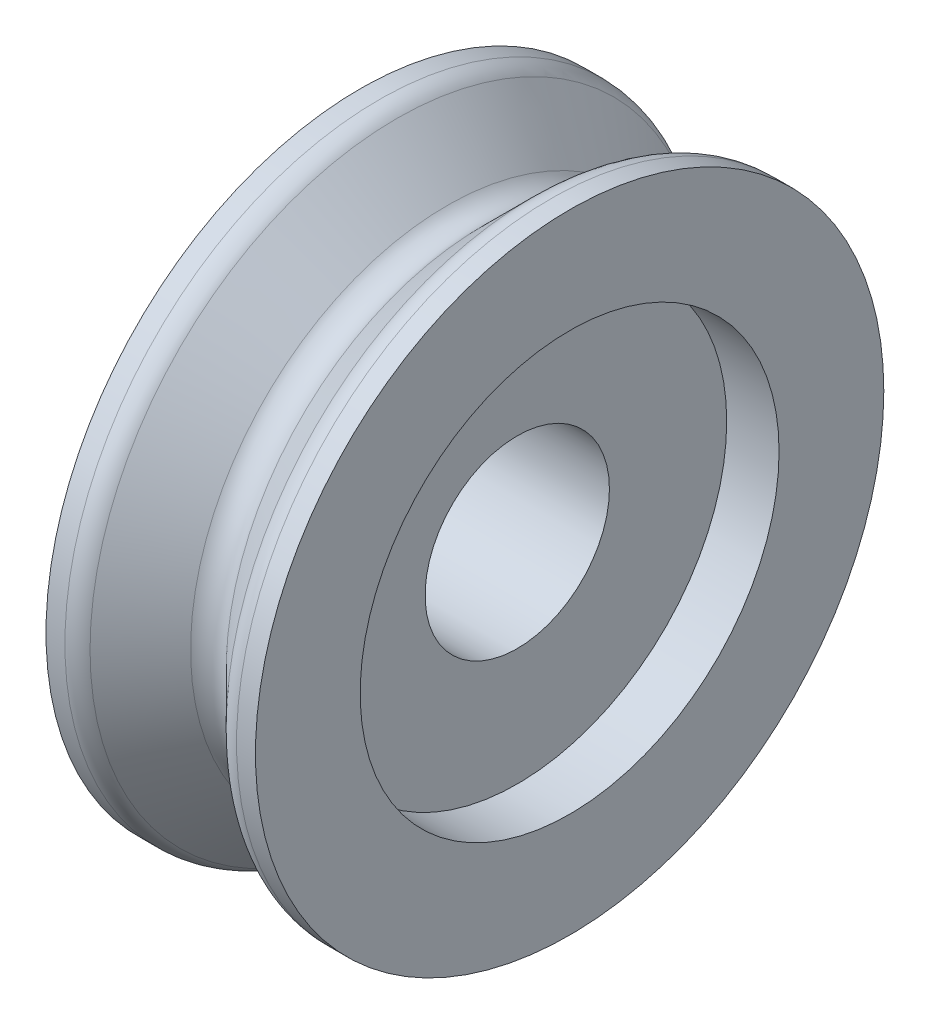
ISO-10303-21;
HEADER;
FILE_DESCRIPTION(('STEP AP214'),'2;1');
FILE_NAME('part.step','',(''),(''),'','','');
FILE_SCHEMA(('AUTOMOTIVE_DESIGN { 1 0 10303 214 1 1 1 1 }'));
ENDSEC;
DATA;
#1=APPLICATION_CONTEXT('core data for automotive mechanical design processes');
#2=APPLICATION_PROTOCOL_DEFINITION('international standard','automotive_design',2000,#1);
#3=PRODUCT_CONTEXT('',#1,'mechanical');
#4=PRODUCT('Part','Part','',(#3));
#5=PRODUCT_RELATED_PRODUCT_CATEGORY('part','',(#4));
#6=PRODUCT_DEFINITION_FORMATION('','',#4);
#7=PRODUCT_DEFINITION_CONTEXT('part definition',#1,'design');
#8=PRODUCT_DEFINITION('design','',#6,#7);
#9=PRODUCT_DEFINITION_SHAPE('','',#8);
#10=(LENGTH_UNIT() NAMED_UNIT(*) SI_UNIT(.MILLI.,.METRE.));
#11=(NAMED_UNIT(*) PLANE_ANGLE_UNIT() SI_UNIT($,.RADIAN.));
#12=(NAMED_UNIT(*) SI_UNIT($,.STERADIAN.) SOLID_ANGLE_UNIT());
#13=UNCERTAINTY_MEASURE_WITH_UNIT(LENGTH_MEASURE(1.E-05),#10,'distance_accuracy_value','');
#14=(GEOMETRIC_REPRESENTATION_CONTEXT(3) GLOBAL_UNCERTAINTY_ASSIGNED_CONTEXT((#13)) GLOBAL_UNIT_ASSIGNED_CONTEXT((#10,
#11,#12)) REPRESENTATION_CONTEXT('',''));
#15=CARTESIAN_POINT('',(0.,0.,0.));
#16=DIRECTION('',(0.,0.,1.));
#17=DIRECTION('',(1.,0.,0.));
#18=AXIS2_PLACEMENT_3D('',#15,#16,#17);
#19=CARTESIAN_POINT('',(-8.9516307345283,0.,0.));
#20=DIRECTION('',(1.,0.,0.));
#21=DIRECTION('',(0.,0.,-1.));
#22=AXIS2_PLACEMENT_3D('',#19,#20,#21);
#23=TOROIDAL_SURFACE('',#22,8.763,0.762);
#24=CARTESIAN_POINT('',(-8.9516307345283,0.,0.));
#25=DIRECTION('',(1.,0.,0.));
#26=DIRECTION('',(0.,0.,-1.));
#27=AXIS2_PLACEMENT_3D('',#24,#25,#26);
#28=CIRCLE('',#27,9.525);
#29=CARTESIAN_POINT('',(-8.9516307345283,0.,-9.525));
#30=VERTEX_POINT('',#29);
#31=EDGE_CURVE('E71',#30,#30,#28,.T.);
#32=ORIENTED_EDGE('',*,*,#31,.T.);
#33=EDGE_LOOP('',(#32));
#34=FACE_BOUND('',#33,.T.);
#35=CARTESIAN_POINT('',(-8.41281536726414,0.,0.));
#36=DIRECTION('',(1.,0.,0.));
#37=DIRECTION('',(0.,0.,-1.));
#38=AXIS2_PLACEMENT_3D('',#35,#36,#37);
#39=CIRCLE('',#38,9.30181536726415);
#40=CARTESIAN_POINT('',(-8.41281536726414,0.,-9.30181536726415));
#41=VERTEX_POINT('',#40);
#42=EDGE_CURVE('E10',#41,#41,#39,.T.);
#43=ORIENTED_EDGE('',*,*,#42,.F.);
#44=EDGE_LOOP('',(#43));
#45=FACE_BOUND('',#44,.T.);
#46=ADVANCED_FACE('F31',(#34,#45),#23,.T.);
#47=CARTESIAN_POINT('',(-6.88881536726415,0.,0.));
#48=DIRECTION('',(-1.,0.,0.));
#49=DIRECTION('',(0.,0.,1.));
#50=AXIS2_PLACEMENT_3D('',#47,#48,#49);
#51=CONICAL_SURFACE('',#50,7.77781536726415,0.785398163397448);
#52=ORIENTED_EDGE('',*,*,#42,.T.);
#53=EDGE_LOOP('',(#52));
#54=FACE_BOUND('',#53,.T.);
#55=CARTESIAN_POINT('',(-6.88881536726415,0.,0.));
#56=DIRECTION('',(1.,0.,0.));
#57=DIRECTION('',(0.,0.,-1.));
#58=AXIS2_PLACEMENT_3D('',#55,#56,#57);
#59=CIRCLE('',#58,7.77781536726415);
#60=CARTESIAN_POINT('',(-6.88881536726415,0.,-7.77781536726415));
#61=VERTEX_POINT('',#60);
#62=EDGE_CURVE('E37',#61,#61,#59,.T.);
#63=ORIENTED_EDGE('',*,*,#62,.F.);
#64=EDGE_LOOP('',(#63));
#65=FACE_BOUND('',#64,.T.);
#66=ADVANCED_FACE('F89',(#54,#65),#51,.T.);
#67=CARTESIAN_POINT('',(-6.35,0.,0.));
#68=DIRECTION('',(1.,0.,0.));
#69=DIRECTION('',(0.,0.,-1.));
#70=AXIS2_PLACEMENT_3D('',#67,#68,#69);
#71=TOROIDAL_SURFACE('',#70,8.3166307345283,0.762);
#72=ORIENTED_EDGE('',*,*,#62,.T.);
#73=EDGE_LOOP('',(#72));
#74=FACE_BOUND('',#73,.T.);
#75=CARTESIAN_POINT('',(-5.81118463273584,0.,0.));
#76=DIRECTION('',(1.,0.,0.));
#77=DIRECTION('',(0.,0.,-1.));
#78=AXIS2_PLACEMENT_3D('',#75,#76,#77);
#79=CIRCLE('',#78,7.77781536726415);
#80=CARTESIAN_POINT('',(-5.81118463273584,0.,-7.77781536726415));
#81=VERTEX_POINT('',#80);
#82=EDGE_CURVE('E41',#81,#81,#79,.T.);
#83=ORIENTED_EDGE('',*,*,#82,.F.);
#84=EDGE_LOOP('',(#83));
#85=FACE_BOUND('',#84,.T.);
#86=ADVANCED_FACE('F93',(#74,#85),#71,.F.);
#87=CARTESIAN_POINT('',(-4.28718463273585,0.,0.));
#88=DIRECTION('',(1.,0.,0.));
#89=DIRECTION('',(0.,0.,-1.));
#90=AXIS2_PLACEMENT_3D('',#87,#88,#89);
#91=CONICAL_SURFACE('',#90,9.30181536726415,0.785398163397448);
#92=ORIENTED_EDGE('',*,*,#82,.T.);
#93=EDGE_LOOP('',(#92));
#94=FACE_BOUND('',#93,.T.);
#95=CARTESIAN_POINT('',(-4.28718463273585,0.,0.));
#96=DIRECTION('',(1.,0.,0.));
#97=DIRECTION('',(0.,0.,-1.));
#98=AXIS2_PLACEMENT_3D('',#95,#96,#97);
#99=CIRCLE('',#98,9.30181536726415);
#100=CARTESIAN_POINT('',(-4.28718463273585,0.,-9.30181536726415));
#101=VERTEX_POINT('',#100);
#102=EDGE_CURVE('E45',#101,#101,#99,.T.);
#103=ORIENTED_EDGE('',*,*,#102,.F.);
#104=EDGE_LOOP('',(#103));
#105=FACE_BOUND('',#104,.T.);
#106=ADVANCED_FACE('F97',(#94,#105),#91,.T.);
#107=CARTESIAN_POINT('',(-3.7483692654717,0.,0.));
#108=DIRECTION('',(1.,0.,0.));
#109=DIRECTION('',(0.,0.,-1.));
#110=AXIS2_PLACEMENT_3D('',#107,#108,#109);
#111=TOROIDAL_SURFACE('',#110,8.763,0.762);
#112=ORIENTED_EDGE('',*,*,#102,.T.);
#113=EDGE_LOOP('',(#112));
#114=FACE_BOUND('',#113,.T.);
#115=CARTESIAN_POINT('',(-3.7483692654717,0.,0.));
#116=DIRECTION('',(1.,0.,0.));
#117=DIRECTION('',(0.,0.,-1.));
#118=AXIS2_PLACEMENT_3D('',#115,#116,#117);
#119=CIRCLE('',#118,9.525);
#120=CARTESIAN_POINT('',(-3.7483692654717,0.,-9.525));
#121=VERTEX_POINT('',#120);
#122=EDGE_CURVE('E50',#121,#121,#119,.T.);
#123=ORIENTED_EDGE('',*,*,#122,.F.);
#124=EDGE_LOOP('',(#123));
#125=FACE_BOUND('',#124,.T.);
#126=ADVANCED_FACE('F103',(#114,#125),#111,.T.);
#127=CARTESIAN_POINT('',(0.,0.,0.));
#128=DIRECTION('',(1.,0.,0.));
#129=DIRECTION('',(0.,0.,-1.));
#130=AXIS2_PLACEMENT_3D('',#127,#128,#129);
#131=CYLINDRICAL_SURFACE('',#130,9.525);
#132=ORIENTED_EDGE('',*,*,#122,.T.);
#133=EDGE_LOOP('',(#132));
#134=FACE_BOUND('',#133,.T.);
#135=CARTESIAN_POINT('',(-3.175,0.,0.));
#136=DIRECTION('',(1.,0.,0.));
#137=DIRECTION('',(0.,0.,-1.));
#138=AXIS2_PLACEMENT_3D('',#135,#136,#137);
#139=CIRCLE('',#138,9.525);
#140=CARTESIAN_POINT('',(-3.175,0.,-9.525));
#141=VERTEX_POINT('',#140);
#142=EDGE_CURVE('E53',#141,#141,#139,.T.);
#143=ORIENTED_EDGE('',*,*,#142,.F.);
#144=EDGE_LOOP('',(#143));
#145=FACE_BOUND('',#144,.T.);
#146=ADVANCED_FACE('F107',(#134,#145),#131,.T.);
#147=CARTESIAN_POINT('',(-3.175,9.525,0.));
#148=DIRECTION('',(1.,0.,0.));
#149=DIRECTION('',(0.,0.,-1.));
#150=AXIS2_PLACEMENT_3D('',#147,#148,#149);
#151=PLANE('',#150);
#152=ORIENTED_EDGE('',*,*,#142,.T.);
#153=EDGE_LOOP('',(#152));
#154=FACE_BOUND('',#153,.T.);
#155=CARTESIAN_POINT('',(-3.175,0.,0.));
#156=DIRECTION('',(1.,0.,0.));
#157=DIRECTION('',(0.,0.,-1.));
#158=AXIS2_PLACEMENT_3D('',#155,#156,#157);
#159=CIRCLE('',#158,6.35);
#160=CARTESIAN_POINT('',(-3.175,0.,-6.35));
#161=VERTEX_POINT('',#160);
#162=EDGE_CURVE('E56',#161,#161,#159,.T.);
#163=ORIENTED_EDGE('',*,*,#162,.F.);
#164=EDGE_LOOP('',(#163));
#165=FACE_BOUND('',#164,.T.);
#166=ADVANCED_FACE('F111',(#154,#165),#151,.T.);
#167=CARTESIAN_POINT('',(0.,0.,0.));
#168=DIRECTION('',(1.,0.,0.));
#169=DIRECTION('',(0.,0.,-1.));
#170=AXIS2_PLACEMENT_3D('',#167,#168,#169);
#171=CYLINDRICAL_SURFACE('',#170,6.35);
#172=ORIENTED_EDGE('',*,*,#162,.T.);
#173=EDGE_LOOP('',(#172));
#174=FACE_BOUND('',#173,.T.);
#175=CARTESIAN_POINT('',(-4.7625,0.,0.));
#176=DIRECTION('',(1.,0.,0.));
#177=DIRECTION('',(0.,0.,-1.));
#178=AXIS2_PLACEMENT_3D('',#175,#176,#177);
#179=CIRCLE('',#178,6.35);
#180=CARTESIAN_POINT('',(-4.7625,0.,-6.35));
#181=VERTEX_POINT('',#180);
#182=EDGE_CURVE('E59',#181,#181,#179,.T.);
#183=ORIENTED_EDGE('',*,*,#182,.F.);
#184=EDGE_LOOP('',(#183));
#185=FACE_BOUND('',#184,.T.);
#186=ADVANCED_FACE('F115',(#174,#185),#171,.F.);
#187=CARTESIAN_POINT('',(-4.7625,6.35,0.));
#188=DIRECTION('',(1.,0.,0.));
#189=DIRECTION('',(0.,0.,-1.));
#190=AXIS2_PLACEMENT_3D('',#187,#188,#189);
#191=PLANE('',#190);
#192=ORIENTED_EDGE('',*,*,#182,.T.);
#193=EDGE_LOOP('',(#192));
#194=FACE_BOUND('',#193,.T.);
#195=CARTESIAN_POINT('',(-4.7625,0.,0.));
#196=DIRECTION('',(1.,0.,0.));
#197=DIRECTION('',(0.,0.,-1.));
#198=AXIS2_PLACEMENT_3D('',#195,#196,#197);
#199=CIRCLE('',#198,2.794);
#200=CARTESIAN_POINT('',(-4.7625,0.,-2.794));
#201=VERTEX_POINT('',#200);
#202=EDGE_CURVE('E62',#201,#201,#199,.T.);
#203=ORIENTED_EDGE('',*,*,#202,.F.);
#204=EDGE_LOOP('',(#203));
#205=FACE_BOUND('',#204,.T.);
#206=ADVANCED_FACE('F119',(#194,#205),#191,.T.);
#207=CARTESIAN_POINT('',(0.,0.,0.));
#208=DIRECTION('',(1.,0.,0.));
#209=DIRECTION('',(0.,0.,-1.));
#210=AXIS2_PLACEMENT_3D('',#207,#208,#209);
#211=CYLINDRICAL_SURFACE('',#210,2.794);
#212=ORIENTED_EDGE('',*,*,#202,.T.);
#213=EDGE_LOOP('',(#212));
#214=FACE_BOUND('',#213,.T.);
#215=CARTESIAN_POINT('',(-9.525,0.,0.));
#216=DIRECTION('',(1.,0.,0.));
#217=DIRECTION('',(0.,0.,-1.));
#218=AXIS2_PLACEMENT_3D('',#215,#216,#217);
#219=CIRCLE('',#218,2.794);
#220=CARTESIAN_POINT('',(-9.525,0.,-2.794));
#221=VERTEX_POINT('',#220);
#222=EDGE_CURVE('E65',#221,#221,#219,.T.);
#223=ORIENTED_EDGE('',*,*,#222,.F.);
#224=EDGE_LOOP('',(#223));
#225=FACE_BOUND('',#224,.T.);
#226=ADVANCED_FACE('F85',(#214,#225),#211,.F.);
#227=CARTESIAN_POINT('',(-9.525,2.794,0.));
#228=DIRECTION('',(-1.,0.,0.));
#229=DIRECTION('',(0.,0.,1.));
#230=AXIS2_PLACEMENT_3D('',#227,#228,#229);
#231=PLANE('',#230);
#232=ORIENTED_EDGE('',*,*,#222,.T.);
#233=EDGE_LOOP('',(#232));
#234=FACE_BOUND('',#233,.T.);
#235=CARTESIAN_POINT('',(-9.525,0.,0.));
#236=DIRECTION('',(1.,0.,0.));
#237=DIRECTION('',(0.,0.,-1.));
#238=AXIS2_PLACEMENT_3D('',#235,#236,#237);
#239=CIRCLE('',#238,9.525);
#240=CARTESIAN_POINT('',(-9.525,0.,-9.525));
#241=VERTEX_POINT('',#240);
#242=EDGE_CURVE('E68',#241,#241,#239,.T.);
#243=ORIENTED_EDGE('',*,*,#242,.F.);
#244=EDGE_LOOP('',(#243));
#245=FACE_BOUND('',#244,.T.);
#246=ADVANCED_FACE('F79',(#234,#245),#231,.T.);
#247=CARTESIAN_POINT('',(0.,0.,0.));
#248=DIRECTION('',(1.,0.,0.));
#249=DIRECTION('',(0.,0.,-1.));
#250=AXIS2_PLACEMENT_3D('',#247,#248,#249);
#251=CYLINDRICAL_SURFACE('',#250,9.525);
#252=ORIENTED_EDGE('',*,*,#242,.T.);
#253=EDGE_LOOP('',(#252));
#254=FACE_BOUND('',#253,.T.);
#255=ORIENTED_EDGE('',*,*,#31,.F.);
#256=EDGE_LOOP('',(#255));
#257=FACE_BOUND('',#256,.T.);
#258=ADVANCED_FACE('F77',(#254,#257),#251,.T.);
#259=CLOSED_SHELL('',(#46,#66,#86,#106,#126,#146,#166,#186,#206,#226,#246,#258));
#260=MANIFOLD_SOLID_BREP('B2',#259);
#261=ADVANCED_BREP_SHAPE_REPRESENTATION('',(#18,#260),#14);
#262=SHAPE_DEFINITION_REPRESENTATION(#9,#261);
ENDSEC;
END-ISO-10303-21;
